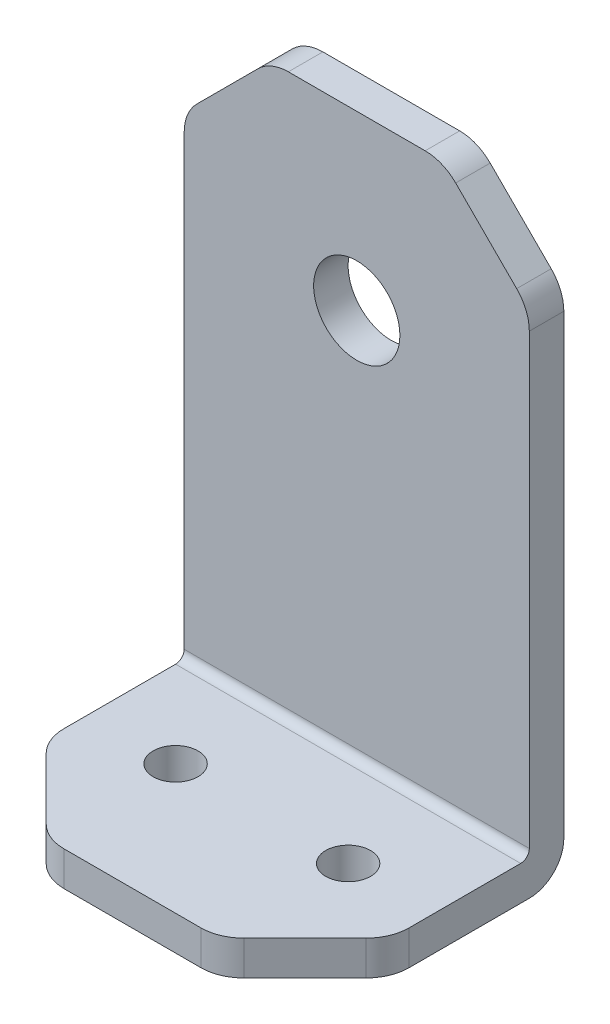
ISO-10303-21;
HEADER;
FILE_DESCRIPTION(('STEP AP214'),'2;1');
FILE_NAME('part.step','',(''),(''),'','','');
FILE_SCHEMA(('AUTOMOTIVE_DESIGN { 1 0 10303 214 1 1 1 1 }'));
ENDSEC;
DATA;
#1=APPLICATION_CONTEXT('core data for automotive mechanical design processes');
#2=APPLICATION_PROTOCOL_DEFINITION('international standard','automotive_design',2000,#1);
#3=PRODUCT_CONTEXT('',#1,'mechanical');
#4=PRODUCT('Part','Part','',(#3));
#5=PRODUCT_RELATED_PRODUCT_CATEGORY('part','',(#4));
#6=PRODUCT_DEFINITION_FORMATION('','',#4);
#7=PRODUCT_DEFINITION_CONTEXT('part definition',#1,'design');
#8=PRODUCT_DEFINITION('design','',#6,#7);
#9=PRODUCT_DEFINITION_SHAPE('','',#8);
#10=(LENGTH_UNIT() NAMED_UNIT(*) SI_UNIT(.MILLI.,.METRE.));
#11=(NAMED_UNIT(*) PLANE_ANGLE_UNIT() SI_UNIT($,.RADIAN.));
#12=(NAMED_UNIT(*) SI_UNIT($,.STERADIAN.) SOLID_ANGLE_UNIT());
#13=UNCERTAINTY_MEASURE_WITH_UNIT(LENGTH_MEASURE(1.E-05),#10,'distance_accuracy_value','');
#14=(GEOMETRIC_REPRESENTATION_CONTEXT(3) GLOBAL_UNCERTAINTY_ASSIGNED_CONTEXT((#13)) GLOBAL_UNIT_ASSIGNED_CONTEXT((#10,
#11,#12)) REPRESENTATION_CONTEXT('',''));
#15=CARTESIAN_POINT('',(0.,0.,0.));
#16=DIRECTION('',(0.,0.,1.));
#17=DIRECTION('',(1.,0.,0.));
#18=AXIS2_PLACEMENT_3D('',#15,#16,#17);
#19=CARTESIAN_POINT('',(0.,4.,0.));
#20=DIRECTION('',(0.,-1.,0.));
#21=DIRECTION('',(0.,0.,-1.));
#22=AXIS2_PLACEMENT_3D('',#19,#20,#21);
#23=PLANE('',#22);
#24=CARTESIAN_POINT('',(10.,4.,0.));
#25=DIRECTION('',(0.,1.,0.));
#26=DIRECTION('',(0.,0.,1.));
#27=AXIS2_PLACEMENT_3D('',#24,#25,#26);
#28=CIRCLE('',#27,2.6);
#29=CARTESIAN_POINT('',(10.,4.,2.6));
#30=VERTEX_POINT('',#29);
#31=EDGE_CURVE('E382',#30,#30,#28,.T.);
#32=ORIENTED_EDGE('',*,*,#31,.F.);
#33=EDGE_LOOP('',(#32));
#34=FACE_BOUND('',#33,.T.);
#35=CARTESIAN_POINT('',(-10.,4.,0.));
#36=DIRECTION('',(0.,1.,0.));
#37=DIRECTION('',(0.,0.,1.));
#38=AXIS2_PLACEMENT_3D('',#35,#36,#37);
#39=CIRCLE('',#38,2.6);
#40=CARTESIAN_POINT('',(-10.,4.,2.6));
#41=VERTEX_POINT('',#40);
#42=EDGE_CURVE('E376',#41,#41,#39,.T.);
#43=ORIENTED_EDGE('',*,*,#42,.F.);
#44=EDGE_LOOP('',(#43));
#45=FACE_BOUND('',#44,.T.);
#46=DIRECTION('',(0.,0.,-1.));
#47=VECTOR('',#46,1.);
#48=CARTESIAN_POINT('',(20.,4.,15.));
#49=LINE('',#48,#47);
#50=CARTESIAN_POINT('',(20.,4.,2.9289321881345));
#51=VERTEX_POINT('',#50);
#52=CARTESIAN_POINT('',(20.,4.,-10.));
#53=VERTEX_POINT('',#52);
#54=EDGE_CURVE('E322',#51,#53,#49,.T.);
#55=ORIENTED_EDGE('',*,*,#54,.T.);
#56=DIRECTION('',(1.,0.,0.));
#57=VECTOR('',#56,1.);
#58=CARTESIAN_POINT('',(-20.,4.,-10.));
#59=LINE('',#58,#57);
#60=CARTESIAN_POINT('',(-20.,4.,-10.));
#61=VERTEX_POINT('',#60);
#62=EDGE_CURVE('E52',#53,#61,#59,.F.);
#63=ORIENTED_EDGE('',*,*,#62,.T.);
#64=DIRECTION('',(0.,0.,1.));
#65=VECTOR('',#64,1.);
#66=CARTESIAN_POINT('',(-20.,4.,15.));
#67=LINE('',#66,#65);
#68=CARTESIAN_POINT('',(-20.,4.,2.92893218813448));
#69=VERTEX_POINT('',#68);
#70=EDGE_CURVE('E324',#61,#69,#67,.T.);
#71=ORIENTED_EDGE('',*,*,#70,.T.);
#72=CARTESIAN_POINT('',(-15.,4.,2.92893218813448));
#73=DIRECTION('',(0.,-1.,0.));
#74=DIRECTION('',(0.,0.,-1.));
#75=AXIS2_PLACEMENT_3D('',#72,#73,#74);
#76=CIRCLE('',#75,5.);
#77=CARTESIAN_POINT('',(-18.5355339059327,4.,6.46446609406721));
#78=VERTEX_POINT('',#77);
#79=EDGE_CURVE('E247',#69,#78,#76,.F.);
#80=ORIENTED_EDGE('',*,*,#79,.T.);
#81=DIRECTION('',(-0.707106781186547,0.,-0.707106781186548));
#82=VECTOR('',#81,1.);
#83=CARTESIAN_POINT('',(-9.99999999999999,4.,15.));
#84=LINE('',#83,#82);
#85=CARTESIAN_POINT('',(-11.4644660940673,4.,13.5355339059327));
#86=VERTEX_POINT('',#85);
#87=EDGE_CURVE('E226',#78,#86,#84,.F.);
#88=ORIENTED_EDGE('',*,*,#87,.T.);
#89=CARTESIAN_POINT('',(-7.92893218813451,4.,9.99999999999999));
#90=DIRECTION('',(0.,-1.,0.));
#91=DIRECTION('',(0.,0.,-1.));
#92=AXIS2_PLACEMENT_3D('',#89,#90,#91);
#93=CIRCLE('',#92,5.);
#94=CARTESIAN_POINT('',(-7.92893218813451,4.,15.));
#95=VERTEX_POINT('',#94);
#96=EDGE_CURVE('E249',#86,#95,#93,.F.);
#97=ORIENTED_EDGE('',*,*,#96,.T.);
#98=DIRECTION('',(1.,0.,0.));
#99=VECTOR('',#98,1.);
#100=CARTESIAN_POINT('',(-20.,4.,15.));
#101=LINE('',#100,#99);
#102=CARTESIAN_POINT('',(7.92893218813449,4.,15.));
#103=VERTEX_POINT('',#102);
#104=EDGE_CURVE('E185',#95,#103,#101,.T.);
#105=ORIENTED_EDGE('',*,*,#104,.T.);
#106=CARTESIAN_POINT('',(7.92893218813449,4.,9.99999999999999));
#107=DIRECTION('',(0.,-1.,0.));
#108=DIRECTION('',(0.,0.,-1.));
#109=AXIS2_PLACEMENT_3D('',#106,#107,#108);
#110=CIRCLE('',#109,5.);
#111=CARTESIAN_POINT('',(11.4644660940672,4.,13.5355339059327));
#112=VERTEX_POINT('',#111);
#113=EDGE_CURVE('E251',#103,#112,#110,.F.);
#114=ORIENTED_EDGE('',*,*,#113,.T.);
#115=DIRECTION('',(-0.707106781186548,0.,0.707106781186547));
#116=VECTOR('',#115,1.);
#117=CARTESIAN_POINT('',(20.,4.,4.99999999999998));
#118=LINE('',#117,#116);
#119=CARTESIAN_POINT('',(18.5355339059327,4.,6.46446609406724));
#120=VERTEX_POINT('',#119);
#121=EDGE_CURVE('E223',#112,#120,#118,.F.);
#122=ORIENTED_EDGE('',*,*,#121,.T.);
#123=CARTESIAN_POINT('',(15.,4.,2.9289321881345));
#124=DIRECTION('',(0.,-1.,0.));
#125=DIRECTION('',(0.,0.,-1.));
#126=AXIS2_PLACEMENT_3D('',#123,#124,#125);
#127=CIRCLE('',#126,5.);
#128=EDGE_CURVE('E253',#120,#51,#127,.F.);
#129=ORIENTED_EDGE('',*,*,#128,.T.);
#130=EDGE_LOOP('',(#55,#63,#71,#80,#88,#97,#105,#114,#122,#129));
#131=FACE_BOUND('',#130,.T.);
#132=ADVANCED_FACE('F37',(#34,#45,#131),#23,.F.);
#133=CARTESIAN_POINT('',(20.,4.,15.));
#134=DIRECTION('',(-1.,0.,0.));
#135=DIRECTION('',(0.,0.,1.));
#136=AXIS2_PLACEMENT_3D('',#133,#134,#135);
#137=PLANE('',#136);
#138=ORIENTED_EDGE('',*,*,#54,.F.);
#139=DIRECTION('',(0.,1.,0.));
#140=VECTOR('',#139,1.);
#141=CARTESIAN_POINT('',(20.,0.,2.9289321881345));
#142=LINE('',#141,#140);
#143=CARTESIAN_POINT('',(20.,0.,2.9289321881345));
#144=VERTEX_POINT('',#143);
#145=EDGE_CURVE('E232',#51,#144,#142,.F.);
#146=ORIENTED_EDGE('',*,*,#145,.T.);
#147=DIRECTION('',(0.,0.,-1.));
#148=VECTOR('',#147,1.);
#149=CARTESIAN_POINT('',(20.,0.,15.));
#150=LINE('',#149,#148);
#151=CARTESIAN_POINT('',(20.,0.,-11.));
#152=VERTEX_POINT('',#151);
#153=EDGE_CURVE('E315',#144,#152,#150,.T.);
#154=ORIENTED_EDGE('',*,*,#153,.T.);
#155=CARTESIAN_POINT('',(20.,4.,-11.));
#156=DIRECTION('',(-1.,0.,0.));
#157=DIRECTION('',(0.,0.,1.));
#158=AXIS2_PLACEMENT_3D('',#155,#156,#157);
#159=CIRCLE('',#158,4.);
#160=CARTESIAN_POINT('',(20.,4.,-15.));
#161=VERTEX_POINT('',#160);
#162=EDGE_CURVE('E204',#152,#161,#159,.F.);
#163=ORIENTED_EDGE('',*,*,#162,.T.);
#164=DIRECTION('',(0.,-1.,0.));
#165=VECTOR('',#164,1.);
#166=CARTESIAN_POINT('',(20.,4.,-15.));
#167=LINE('',#166,#165);
#168=CARTESIAN_POINT('',(20.,56.9289321881345,-15.));
#169=VERTEX_POINT('',#168);
#170=EDGE_CURVE('E184',#169,#161,#167,.T.);
#171=ORIENTED_EDGE('',*,*,#170,.F.);
#172=DIRECTION('',(0.,0.,1.));
#173=VECTOR('',#172,1.);
#174=CARTESIAN_POINT('',(20.,56.9289321881345,-11.));
#175=LINE('',#174,#173);
#176=CARTESIAN_POINT('',(20.,56.9289321881345,-11.));
#177=VERTEX_POINT('',#176);
#178=EDGE_CURVE('E229',#169,#177,#175,.T.);
#179=ORIENTED_EDGE('',*,*,#178,.T.);
#180=DIRECTION('',(0.,-1.,0.));
#181=VECTOR('',#180,1.);
#182=CARTESIAN_POINT('',(20.,69.,-11.));
#183=LINE('',#182,#181);
#184=CARTESIAN_POINT('',(20.,5.,-11.));
#185=VERTEX_POINT('',#184);
#186=EDGE_CURVE('E307',#177,#185,#183,.T.);
#187=ORIENTED_EDGE('',*,*,#186,.T.);
#188=CARTESIAN_POINT('',(20.,5.,-10.));
#189=DIRECTION('',(-1.,0.,0.));
#190=DIRECTION('',(0.,0.,1.));
#191=AXIS2_PLACEMENT_3D('',#188,#189,#190);
#192=CIRCLE('',#191,1.);
#193=EDGE_CURVE('E45',#185,#53,#192,.T.);
#194=ORIENTED_EDGE('',*,*,#193,.T.);
#195=EDGE_LOOP('',(#138,#146,#154,#163,#171,#179,#187,#194));
#196=FACE_BOUND('',#195,.T.);
#197=ADVANCED_FACE('F311',(#196),#137,.F.);
#198=CARTESIAN_POINT('',(-20.,4.,-15.));
#199=DIRECTION('',(0.,0.,1.));
#200=DIRECTION('',(1.,0.,0.));
#201=AXIS2_PLACEMENT_3D('',#198,#199,#200);
#202=PLANE('',#201);
#203=CARTESIAN_POINT('',(0.,49.,-15.));
#204=DIRECTION('',(0.,0.,1.));
#205=DIRECTION('',(1.,0.,0.));
#206=AXIS2_PLACEMENT_3D('',#203,#204,#205);
#207=CIRCLE('',#206,5.00000000000001);
#208=CARTESIAN_POINT('',(5.00000000000001,49.,-15.));
#209=VERTEX_POINT('',#208);
#210=EDGE_CURVE('E385',#209,#209,#207,.T.);
#211=ORIENTED_EDGE('',*,*,#210,.T.);
#212=EDGE_LOOP('',(#211));
#213=FACE_BOUND('',#212,.T.);
#214=DIRECTION('',(0.707106781186547,-0.707106781186548,0.));
#215=VECTOR('',#214,1.);
#216=CARTESIAN_POINT('',(9.99999999999998,69.,-15.));
#217=LINE('',#216,#215);
#218=CARTESIAN_POINT('',(11.4644660940672,67.5355339059327,-15.));
#219=VERTEX_POINT('',#218);
#220=CARTESIAN_POINT('',(18.5355339059327,60.4644660940672,-15.));
#221=VERTEX_POINT('',#220);
#222=EDGE_CURVE('E209',#219,#221,#217,.T.);
#223=ORIENTED_EDGE('',*,*,#222,.T.);
#224=CARTESIAN_POINT('',(15.,56.9289321881345,-15.));
#225=DIRECTION('',(0.,0.,1.));
#226=DIRECTION('',(1.,0.,0.));
#227=AXIS2_PLACEMENT_3D('',#224,#225,#226);
#228=CIRCLE('',#227,5.);
#229=EDGE_CURVE('E287',#221,#169,#228,.F.);
#230=ORIENTED_EDGE('',*,*,#229,.T.);
#231=ORIENTED_EDGE('',*,*,#170,.T.);
#232=DIRECTION('',(-1.,0.,0.));
#233=VECTOR('',#232,1.);
#234=CARTESIAN_POINT('',(-20.,4.,-15.));
#235=LINE('',#234,#233);
#236=CARTESIAN_POINT('',(-20.,4.,-15.));
#237=VERTEX_POINT('',#236);
#238=EDGE_CURVE('E192',#161,#237,#235,.T.);
#239=ORIENTED_EDGE('',*,*,#238,.T.);
#240=DIRECTION('',(0.,-1.,0.));
#241=VECTOR('',#240,1.);
#242=CARTESIAN_POINT('',(-20.,4.,-15.));
#243=LINE('',#242,#241);
#244=CARTESIAN_POINT('',(-20.,56.9289321881345,-15.));
#245=VERTEX_POINT('',#244);
#246=EDGE_CURVE('E173',#245,#237,#243,.T.);
#247=ORIENTED_EDGE('',*,*,#246,.F.);
#248=CARTESIAN_POINT('',(-15.,56.9289321881345,-15.));
#249=DIRECTION('',(0.,0.,1.));
#250=DIRECTION('',(1.,0.,0.));
#251=AXIS2_PLACEMENT_3D('',#248,#249,#250);
#252=CIRCLE('',#251,5.);
#253=CARTESIAN_POINT('',(-18.5355339059328,60.4644660940672,-15.));
#254=VERTEX_POINT('',#253);
#255=EDGE_CURVE('E281',#245,#254,#252,.F.);
#256=ORIENTED_EDGE('',*,*,#255,.T.);
#257=DIRECTION('',(0.707106781186547,0.707106781186548,0.));
#258=VECTOR('',#257,1.);
#259=CARTESIAN_POINT('',(-9.99999999999999,69.,-15.));
#260=LINE('',#259,#258);
#261=CARTESIAN_POINT('',(-11.4644660940673,67.5355339059327,-15.));
#262=VERTEX_POINT('',#261);
#263=EDGE_CURVE('E206',#254,#262,#260,.T.);
#264=ORIENTED_EDGE('',*,*,#263,.T.);
#265=CARTESIAN_POINT('',(-7.92893218813451,64.,-15.));
#266=DIRECTION('',(0.,0.,1.));
#267=DIRECTION('',(1.,0.,0.));
#268=AXIS2_PLACEMENT_3D('',#265,#266,#267);
#269=CIRCLE('',#268,5.);
#270=CARTESIAN_POINT('',(-7.92893218813451,69.,-15.));
#271=VERTEX_POINT('',#270);
#272=EDGE_CURVE('E283',#262,#271,#269,.F.);
#273=ORIENTED_EDGE('',*,*,#272,.T.);
#274=DIRECTION('',(-1.,0.,0.));
#275=VECTOR('',#274,1.);
#276=CARTESIAN_POINT('',(-20.,69.,-15.));
#277=LINE('',#276,#275);
#278=CARTESIAN_POINT('',(7.9289321881345,69.,-15.));
#279=VERTEX_POINT('',#278);
#280=EDGE_CURVE('E313',#279,#271,#277,.T.);
#281=ORIENTED_EDGE('',*,*,#280,.F.);
#282=CARTESIAN_POINT('',(7.9289321881345,64.,-15.));
#283=DIRECTION('',(0.,0.,1.));
#284=DIRECTION('',(1.,0.,0.));
#285=AXIS2_PLACEMENT_3D('',#282,#283,#284);
#286=CIRCLE('',#285,5.);
#287=EDGE_CURVE('E285',#279,#219,#286,.F.);
#288=ORIENTED_EDGE('',*,*,#287,.T.);
#289=EDGE_LOOP('',(#223,#230,#231,#239,#247,#256,#264,#273,#281,#288));
#290=FACE_BOUND('',#289,.T.);
#291=ADVANCED_FACE('F197',(#213,#290),#202,.F.);
#292=CARTESIAN_POINT('',(-20.,4.,15.));
#293=DIRECTION('',(1.,0.,0.));
#294=DIRECTION('',(0.,0.,-1.));
#295=AXIS2_PLACEMENT_3D('',#292,#293,#294);
#296=PLANE('',#295);
#297=DIRECTION('',(0.,0.,1.));
#298=VECTOR('',#297,1.);
#299=CARTESIAN_POINT('',(-20.,0.,15.));
#300=LINE('',#299,#298);
#301=CARTESIAN_POINT('',(-20.,0.,-11.));
#302=VERTEX_POINT('',#301);
#303=CARTESIAN_POINT('',(-20.,0.,2.92893218813448));
#304=VERTEX_POINT('',#303);
#305=EDGE_CURVE('E330',#302,#304,#300,.T.);
#306=ORIENTED_EDGE('',*,*,#305,.T.);
#307=DIRECTION('',(0.,-1.,0.));
#308=VECTOR('',#307,1.);
#309=CARTESIAN_POINT('',(-20.,4.,2.92893218813448));
#310=LINE('',#309,#308);
#311=EDGE_CURVE('E266',#304,#69,#310,.F.);
#312=ORIENTED_EDGE('',*,*,#311,.T.);
#313=ORIENTED_EDGE('',*,*,#70,.F.);
#314=CARTESIAN_POINT('',(-20.,5.,-10.));
#315=DIRECTION('',(1.,0.,0.));
#316=DIRECTION('',(0.,0.,-1.));
#317=AXIS2_PLACEMENT_3D('',#314,#315,#316);
#318=CIRCLE('',#317,1.);
#319=CARTESIAN_POINT('',(-20.,5.,-11.));
#320=VERTEX_POINT('',#319);
#321=EDGE_CURVE('E11',#61,#320,#318,.T.);
#322=ORIENTED_EDGE('',*,*,#321,.T.);
#323=DIRECTION('',(0.,-1.,0.));
#324=VECTOR('',#323,1.);
#325=CARTESIAN_POINT('',(-20.,69.,-11.));
#326=LINE('',#325,#324);
#327=CARTESIAN_POINT('',(-20.,56.9289321881345,-11.));
#328=VERTEX_POINT('',#327);
#329=EDGE_CURVE('E308',#328,#320,#326,.T.);
#330=ORIENTED_EDGE('',*,*,#329,.F.);
#331=DIRECTION('',(0.,0.,-1.));
#332=VECTOR('',#331,1.);
#333=CARTESIAN_POINT('',(-20.,56.9289321881345,-15.));
#334=LINE('',#333,#332);
#335=EDGE_CURVE('E181',#328,#245,#334,.T.);
#336=ORIENTED_EDGE('',*,*,#335,.T.);
#337=ORIENTED_EDGE('',*,*,#246,.T.);
#338=CARTESIAN_POINT('',(-20.,4.,-11.));
#339=DIRECTION('',(1.,0.,0.));
#340=DIRECTION('',(0.,0.,-1.));
#341=AXIS2_PLACEMENT_3D('',#338,#339,#340);
#342=CIRCLE('',#341,4.);
#343=EDGE_CURVE('E177',#237,#302,#342,.F.);
#344=ORIENTED_EDGE('',*,*,#343,.T.);
#345=EDGE_LOOP('',(#306,#312,#313,#322,#330,#336,#337,#344));
#346=FACE_BOUND('',#345,.T.);
#347=ADVANCED_FACE('F176',(#346),#296,.F.);
#348=CARTESIAN_POINT('',(-20.,4.,15.));
#349=DIRECTION('',(0.,0.,-1.));
#350=DIRECTION('',(-1.,0.,0.));
#351=AXIS2_PLACEMENT_3D('',#348,#349,#350);
#352=PLANE('',#351);
#353=DIRECTION('',(1.,0.,0.));
#354=VECTOR('',#353,1.);
#355=CARTESIAN_POINT('',(-20.,0.,15.));
#356=LINE('',#355,#354);
#357=CARTESIAN_POINT('',(-7.92893218813451,0.,15.));
#358=VERTEX_POINT('',#357);
#359=CARTESIAN_POINT('',(7.92893218813449,0.,15.));
#360=VERTEX_POINT('',#359);
#361=EDGE_CURVE('E325',#358,#360,#356,.T.);
#362=ORIENTED_EDGE('',*,*,#361,.T.);
#363=DIRECTION('',(0.,-1.,0.));
#364=VECTOR('',#363,1.);
#365=CARTESIAN_POINT('',(7.92893218813449,4.,15.));
#366=LINE('',#365,#364);
#367=EDGE_CURVE('E258',#360,#103,#366,.F.);
#368=ORIENTED_EDGE('',*,*,#367,.T.);
#369=ORIENTED_EDGE('',*,*,#104,.F.);
#370=DIRECTION('',(0.,1.,0.));
#371=VECTOR('',#370,1.);
#372=CARTESIAN_POINT('',(-7.92893218813451,0.,15.));
#373=LINE('',#372,#371);
#374=EDGE_CURVE('E255',#95,#358,#373,.F.);
#375=ORIENTED_EDGE('',*,*,#374,.T.);
#376=EDGE_LOOP('',(#362,#368,#369,#375));
#377=FACE_BOUND('',#376,.T.);
#378=ADVANCED_FACE('F336',(#377),#352,.F.);
#379=CARTESIAN_POINT('',(0.,0.,0.));
#380=DIRECTION('',(0.,-1.,0.));
#381=DIRECTION('',(0.,0.,-1.));
#382=AXIS2_PLACEMENT_3D('',#379,#380,#381);
#383=PLANE('',#382);
#384=CARTESIAN_POINT('',(10.,0.,0.));
#385=DIRECTION('',(0.,1.,0.));
#386=DIRECTION('',(0.,0.,1.));
#387=AXIS2_PLACEMENT_3D('',#384,#385,#386);
#388=CIRCLE('',#387,2.6);
#389=CARTESIAN_POINT('',(10.,0.,2.6));
#390=VERTEX_POINT('',#389);
#391=EDGE_CURVE('E380',#390,#390,#388,.T.);
#392=ORIENTED_EDGE('',*,*,#391,.T.);
#393=EDGE_LOOP('',(#392));
#394=FACE_BOUND('',#393,.T.);
#395=CARTESIAN_POINT('',(-10.,0.,0.));
#396=DIRECTION('',(0.,1.,0.));
#397=DIRECTION('',(0.,0.,1.));
#398=AXIS2_PLACEMENT_3D('',#395,#396,#397);
#399=CIRCLE('',#398,2.6);
#400=CARTESIAN_POINT('',(-10.,0.,2.6));
#401=VERTEX_POINT('',#400);
#402=EDGE_CURVE('E374',#401,#401,#399,.T.);
#403=ORIENTED_EDGE('',*,*,#402,.T.);
#404=EDGE_LOOP('',(#403));
#405=FACE_BOUND('',#404,.T.);
#406=ORIENTED_EDGE('',*,*,#153,.F.);
#407=CARTESIAN_POINT('',(15.,0.,2.9289321881345));
#408=DIRECTION('',(0.,-1.,0.));
#409=DIRECTION('',(0.,0.,-1.));
#410=AXIS2_PLACEMENT_3D('',#407,#408,#409);
#411=CIRCLE('',#410,5.);
#412=CARTESIAN_POINT('',(18.5355339059327,0.,6.46446609406724));
#413=VERTEX_POINT('',#412);
#414=EDGE_CURVE('E241',#144,#413,#411,.T.);
#415=ORIENTED_EDGE('',*,*,#414,.T.);
#416=DIRECTION('',(0.707106781186548,0.,-0.707106781186547));
#417=VECTOR('',#416,1.);
#418=CARTESIAN_POINT('',(12.5,0.,12.5));
#419=LINE('',#418,#417);
#420=CARTESIAN_POINT('',(11.4644660940672,0.,13.5355339059327));
#421=VERTEX_POINT('',#420);
#422=EDGE_CURVE('E217',#413,#421,#419,.F.);
#423=ORIENTED_EDGE('',*,*,#422,.T.);
#424=CARTESIAN_POINT('',(7.92893218813449,0.,9.99999999999999));
#425=DIRECTION('',(0.,-1.,0.));
#426=DIRECTION('',(0.,0.,-1.));
#427=AXIS2_PLACEMENT_3D('',#424,#425,#426);
#428=CIRCLE('',#427,5.);
#429=EDGE_CURVE('E239',#421,#360,#428,.T.);
#430=ORIENTED_EDGE('',*,*,#429,.T.);
#431=ORIENTED_EDGE('',*,*,#361,.F.);
#432=CARTESIAN_POINT('',(-7.92893218813451,0.,9.99999999999999));
#433=DIRECTION('',(0.,-1.,0.));
#434=DIRECTION('',(0.,0.,-1.));
#435=AXIS2_PLACEMENT_3D('',#432,#433,#434);
#436=CIRCLE('',#435,5.);
#437=CARTESIAN_POINT('',(-11.4644660940673,0.,13.5355339059327));
#438=VERTEX_POINT('',#437);
#439=EDGE_CURVE('E237',#358,#438,#436,.T.);
#440=ORIENTED_EDGE('',*,*,#439,.T.);
#441=DIRECTION('',(0.707106781186547,0.,0.707106781186548));
#442=VECTOR('',#441,1.);
#443=CARTESIAN_POINT('',(-12.5,0.,12.5));
#444=LINE('',#443,#442);
#445=CARTESIAN_POINT('',(-18.5355339059327,0.,6.46446609406722));
#446=VERTEX_POINT('',#445);
#447=EDGE_CURVE('E220',#438,#446,#444,.F.);
#448=ORIENTED_EDGE('',*,*,#447,.T.);
#449=CARTESIAN_POINT('',(-15.,0.,2.92893218813448));
#450=DIRECTION('',(0.,-1.,0.));
#451=DIRECTION('',(0.,0.,-1.));
#452=AXIS2_PLACEMENT_3D('',#449,#450,#451);
#453=CIRCLE('',#452,5.);
#454=EDGE_CURVE('E235',#446,#304,#453,.T.);
#455=ORIENTED_EDGE('',*,*,#454,.T.);
#456=ORIENTED_EDGE('',*,*,#305,.F.);
#457=DIRECTION('',(-1.,0.,0.));
#458=VECTOR('',#457,1.);
#459=CARTESIAN_POINT('',(20.,0.,-11.));
#460=LINE('',#459,#458);
#461=EDGE_CURVE('E194',#302,#152,#460,.F.);
#462=ORIENTED_EDGE('',*,*,#461,.T.);
#463=EDGE_LOOP('',(#406,#415,#423,#430,#431,#440,#448,#455,#456,#462));
#464=FACE_BOUND('',#463,.T.);
#465=ADVANCED_FACE('F354',(#394,#405,#464),#383,.T.);
#466=CARTESIAN_POINT('',(-20.,69.,-11.));
#467=DIRECTION('',(0.,0.,-1.));
#468=DIRECTION('',(-1.,0.,0.));
#469=AXIS2_PLACEMENT_3D('',#466,#467,#468);
#470=PLANE('',#469);
#471=CARTESIAN_POINT('',(0.,49.,-11.));
#472=DIRECTION('',(0.,0.,1.));
#473=DIRECTION('',(1.,0.,0.));
#474=AXIS2_PLACEMENT_3D('',#471,#472,#473);
#475=CIRCLE('',#474,5.00000000000001);
#476=CARTESIAN_POINT('',(5.00000000000001,49.,-11.));
#477=VERTEX_POINT('',#476);
#478=EDGE_CURVE('E388',#477,#477,#475,.T.);
#479=ORIENTED_EDGE('',*,*,#478,.F.);
#480=EDGE_LOOP('',(#479));
#481=FACE_BOUND('',#480,.T.);
#482=ORIENTED_EDGE('',*,*,#329,.T.);
#483=DIRECTION('',(1.,0.,0.));
#484=VECTOR('',#483,1.);
#485=CARTESIAN_POINT('',(20.,5.,-11.));
#486=LINE('',#485,#484);
#487=EDGE_CURVE('E299',#320,#185,#486,.T.);
#488=ORIENTED_EDGE('',*,*,#487,.T.);
#489=ORIENTED_EDGE('',*,*,#186,.F.);
#490=CARTESIAN_POINT('',(15.,56.9289321881345,-11.));
#491=DIRECTION('',(0.,0.,-1.));
#492=DIRECTION('',(-1.,0.,0.));
#493=AXIS2_PLACEMENT_3D('',#490,#491,#492);
#494=CIRCLE('',#493,5.);
#495=CARTESIAN_POINT('',(18.5355339059327,60.4644660940672,-11.));
#496=VERTEX_POINT('',#495);
#497=EDGE_CURVE('E275',#177,#496,#494,.F.);
#498=ORIENTED_EDGE('',*,*,#497,.T.);
#499=DIRECTION('',(-0.707106781186547,0.707106781186548,0.));
#500=VECTOR('',#499,1.);
#501=CARTESIAN_POINT('',(9.99999999999998,69.,-11.));
#502=LINE('',#501,#500);
#503=CARTESIAN_POINT('',(11.4644660940672,67.5355339059327,-11.));
#504=VERTEX_POINT('',#503);
#505=EDGE_CURVE('E214',#496,#504,#502,.T.);
#506=ORIENTED_EDGE('',*,*,#505,.T.);
#507=CARTESIAN_POINT('',(7.9289321881345,64.,-11.));
#508=DIRECTION('',(0.,0.,-1.));
#509=DIRECTION('',(-1.,0.,0.));
#510=AXIS2_PLACEMENT_3D('',#507,#508,#509);
#511=CIRCLE('',#510,5.);
#512=CARTESIAN_POINT('',(7.9289321881345,69.,-11.));
#513=VERTEX_POINT('',#512);
#514=EDGE_CURVE('E273',#504,#513,#511,.F.);
#515=ORIENTED_EDGE('',*,*,#514,.T.);
#516=DIRECTION('',(1.,0.,0.));
#517=VECTOR('',#516,1.);
#518=CARTESIAN_POINT('',(-20.,69.,-11.));
#519=LINE('',#518,#517);
#520=CARTESIAN_POINT('',(-7.92893218813451,69.,-11.));
#521=VERTEX_POINT('',#520);
#522=EDGE_CURVE('E318',#521,#513,#519,.T.);
#523=ORIENTED_EDGE('',*,*,#522,.F.);
#524=CARTESIAN_POINT('',(-7.92893218813451,64.,-11.));
#525=DIRECTION('',(0.,0.,-1.));
#526=DIRECTION('',(-1.,0.,0.));
#527=AXIS2_PLACEMENT_3D('',#524,#525,#526);
#528=CIRCLE('',#527,5.);
#529=CARTESIAN_POINT('',(-11.4644660940673,67.5355339059327,-11.));
#530=VERTEX_POINT('',#529);
#531=EDGE_CURVE('E271',#521,#530,#528,.F.);
#532=ORIENTED_EDGE('',*,*,#531,.T.);
#533=DIRECTION('',(-0.707106781186547,-0.707106781186548,0.));
#534=VECTOR('',#533,1.);
#535=CARTESIAN_POINT('',(-9.99999999999999,69.,-11.));
#536=LINE('',#535,#534);
#537=CARTESIAN_POINT('',(-18.5355339059328,60.4644660940672,-11.));
#538=VERTEX_POINT('',#537);
#539=EDGE_CURVE('E211',#530,#538,#536,.T.);
#540=ORIENTED_EDGE('',*,*,#539,.T.);
#541=CARTESIAN_POINT('',(-15.,56.9289321881345,-11.));
#542=DIRECTION('',(0.,0.,-1.));
#543=DIRECTION('',(-1.,0.,0.));
#544=AXIS2_PLACEMENT_3D('',#541,#542,#543);
#545=CIRCLE('',#544,5.);
#546=EDGE_CURVE('E269',#538,#328,#545,.F.);
#547=ORIENTED_EDGE('',*,*,#546,.T.);
#548=EDGE_LOOP('',(#482,#488,#489,#498,#506,#515,#523,#532,#540,#547));
#549=FACE_BOUND('',#548,.T.);
#550=ADVANCED_FACE('F306',(#481,#549),#470,.F.);
#551=CARTESIAN_POINT('',(0.,69.,0.));
#552=DIRECTION('',(0.,1.,0.));
#553=DIRECTION('',(0.,0.,1.));
#554=AXIS2_PLACEMENT_3D('',#551,#552,#553);
#555=PLANE('',#554);
#556=ORIENTED_EDGE('',*,*,#522,.T.);
#557=DIRECTION('',(0.,0.,-1.));
#558=VECTOR('',#557,1.);
#559=CARTESIAN_POINT('',(7.9289321881345,69.,0.));
#560=LINE('',#559,#558);
#561=EDGE_CURVE('E292',#513,#279,#560,.T.);
#562=ORIENTED_EDGE('',*,*,#561,.T.);
#563=ORIENTED_EDGE('',*,*,#280,.T.);
#564=DIRECTION('',(0.,0.,1.));
#565=VECTOR('',#564,1.);
#566=CARTESIAN_POINT('',(-7.92893218813451,69.,0.));
#567=LINE('',#566,#565);
#568=EDGE_CURVE('E289',#271,#521,#567,.T.);
#569=ORIENTED_EDGE('',*,*,#568,.T.);
#570=EDGE_LOOP('',(#556,#562,#563,#569));
#571=FACE_BOUND('',#570,.T.);
#572=ADVANCED_FACE('F371',(#571),#555,.T.);
#573=CARTESIAN_POINT('',(-20.,4.,-11.));
#574=DIRECTION('',(1.,0.,0.));
#575=DIRECTION('',(0.,0.,-1.));
#576=AXIS2_PLACEMENT_3D('',#573,#574,#575);
#577=CYLINDRICAL_SURFACE('',#576,4.);
#578=ORIENTED_EDGE('',*,*,#162,.F.);
#579=ORIENTED_EDGE('',*,*,#461,.F.);
#580=ORIENTED_EDGE('',*,*,#343,.F.);
#581=ORIENTED_EDGE('',*,*,#238,.F.);
#582=EDGE_LOOP('',(#578,#579,#580,#581));
#583=FACE_BOUND('',#582,.T.);
#584=ADVANCED_FACE('F191',(#583),#577,.T.);
#585=CARTESIAN_POINT('',(-10.,0.,0.));
#586=DIRECTION('',(0.,1.,0.));
#587=DIRECTION('',(0.,0.,1.));
#588=AXIS2_PLACEMENT_3D('',#585,#586,#587);
#589=CYLINDRICAL_SURFACE('',#588,2.6);
#590=ORIENTED_EDGE('',*,*,#402,.F.);
#591=EDGE_LOOP('',(#590));
#592=FACE_BOUND('',#591,.T.);
#593=ORIENTED_EDGE('',*,*,#42,.T.);
#594=EDGE_LOOP('',(#593));
#595=FACE_BOUND('',#594,.T.);
#596=ADVANCED_FACE('F429',(#592,#595),#589,.F.);
#597=CARTESIAN_POINT('',(10.,0.,0.));
#598=DIRECTION('',(0.,1.,0.));
#599=DIRECTION('',(0.,0.,1.));
#600=AXIS2_PLACEMENT_3D('',#597,#598,#599);
#601=CYLINDRICAL_SURFACE('',#600,2.6);
#602=ORIENTED_EDGE('',*,*,#391,.F.);
#603=EDGE_LOOP('',(#602));
#604=FACE_BOUND('',#603,.T.);
#605=ORIENTED_EDGE('',*,*,#31,.T.);
#606=EDGE_LOOP('',(#605));
#607=FACE_BOUND('',#606,.T.);
#608=ADVANCED_FACE('F398',(#604,#607),#601,.F.);
#609=CARTESIAN_POINT('',(0.,49.,-15.));
#610=DIRECTION('',(0.,0.,1.));
#611=DIRECTION('',(1.,0.,0.));
#612=AXIS2_PLACEMENT_3D('',#609,#610,#611);
#613=CYLINDRICAL_SURFACE('',#612,5.00000000000001);
#614=ORIENTED_EDGE('',*,*,#210,.F.);
#615=EDGE_LOOP('',(#614));
#616=FACE_BOUND('',#615,.T.);
#617=ORIENTED_EDGE('',*,*,#478,.T.);
#618=EDGE_LOOP('',(#617));
#619=FACE_BOUND('',#618,.T.);
#620=ADVANCED_FACE('F395',(#616,#619),#613,.F.);
#621=CARTESIAN_POINT('',(9.99999999999998,69.,0.));
#622=DIRECTION('',(0.707106781186548,0.707106781186547,0.));
#623=DIRECTION('',(0.,0.,1.));
#624=AXIS2_PLACEMENT_3D('',#621,#622,#623);
#625=PLANE('',#624);
#626=ORIENTED_EDGE('',*,*,#505,.F.);
#627=DIRECTION('',(0.,0.,1.));
#628=VECTOR('',#627,1.);
#629=CARTESIAN_POINT('',(18.5355339059327,60.4644660940672,-15.));
#630=LINE('',#629,#628);
#631=EDGE_CURVE('E279',#496,#221,#630,.F.);
#632=ORIENTED_EDGE('',*,*,#631,.T.);
#633=ORIENTED_EDGE('',*,*,#222,.F.);
#634=DIRECTION('',(0.,0.,-1.));
#635=VECTOR('',#634,1.);
#636=CARTESIAN_POINT('',(11.4644660940672,67.5355339059327,0.));
#637=LINE('',#636,#635);
#638=EDGE_CURVE('E277',#219,#504,#637,.F.);
#639=ORIENTED_EDGE('',*,*,#638,.T.);
#640=EDGE_LOOP('',(#626,#632,#633,#639));
#641=FACE_BOUND('',#640,.T.);
#642=ADVANCED_FACE('F362',(#641),#625,.T.);
#643=CARTESIAN_POINT('',(-9.99999999999999,69.,0.));
#644=DIRECTION('',(-0.707106781186548,0.707106781186547,0.));
#645=DIRECTION('',(0.,0.,-1.));
#646=AXIS2_PLACEMENT_3D('',#643,#644,#645);
#647=PLANE('',#646);
#648=ORIENTED_EDGE('',*,*,#539,.F.);
#649=DIRECTION('',(0.,0.,1.));
#650=VECTOR('',#649,1.);
#651=CARTESIAN_POINT('',(-11.4644660940673,67.5355339059327,0.));
#652=LINE('',#651,#650);
#653=EDGE_CURVE('E297',#530,#262,#652,.F.);
#654=ORIENTED_EDGE('',*,*,#653,.T.);
#655=ORIENTED_EDGE('',*,*,#263,.F.);
#656=DIRECTION('',(0.,0.,-1.));
#657=VECTOR('',#656,1.);
#658=CARTESIAN_POINT('',(-18.5355339059328,60.4644660940672,-11.));
#659=LINE('',#658,#657);
#660=EDGE_CURVE('E295',#254,#538,#659,.F.);
#661=ORIENTED_EDGE('',*,*,#660,.T.);
#662=EDGE_LOOP('',(#648,#654,#655,#661));
#663=FACE_BOUND('',#662,.T.);
#664=ADVANCED_FACE('F436',(#663),#647,.T.);
#665=CARTESIAN_POINT('',(-9.99999999999999,4.,15.));
#666=DIRECTION('',(0.707106781186548,0.,-0.707106781186547));
#667=DIRECTION('',(0.,-1.,0.));
#668=AXIS2_PLACEMENT_3D('',#665,#666,#667);
#669=PLANE('',#668);
#670=ORIENTED_EDGE('',*,*,#447,.F.);
#671=DIRECTION('',(0.,-1.,0.));
#672=VECTOR('',#671,1.);
#673=CARTESIAN_POINT('',(-11.4644660940673,4.,13.5355339059327));
#674=LINE('',#673,#672);
#675=EDGE_CURVE('E263',#438,#86,#674,.F.);
#676=ORIENTED_EDGE('',*,*,#675,.T.);
#677=ORIENTED_EDGE('',*,*,#87,.F.);
#678=DIRECTION('',(0.,1.,0.));
#679=VECTOR('',#678,1.);
#680=CARTESIAN_POINT('',(-18.5355339059327,0.,6.46446609406722));
#681=LINE('',#680,#679);
#682=EDGE_CURVE('E261',#78,#446,#681,.F.);
#683=ORIENTED_EDGE('',*,*,#682,.T.);
#684=EDGE_LOOP('',(#670,#676,#677,#683));
#685=FACE_BOUND('',#684,.T.);
#686=ADVANCED_FACE('F442',(#685),#669,.F.);
#687=CARTESIAN_POINT('',(20.,4.,4.99999999999998));
#688=DIRECTION('',(-0.707106781186547,0.,-0.707106781186548));
#689=DIRECTION('',(0.,-1.,0.));
#690=AXIS2_PLACEMENT_3D('',#687,#688,#689);
#691=PLANE('',#690);
#692=ORIENTED_EDGE('',*,*,#422,.F.);
#693=DIRECTION('',(0.,-1.,0.));
#694=VECTOR('',#693,1.);
#695=CARTESIAN_POINT('',(18.5355339059327,4.,6.46446609406724));
#696=LINE('',#695,#694);
#697=EDGE_CURVE('E245',#413,#120,#696,.F.);
#698=ORIENTED_EDGE('',*,*,#697,.T.);
#699=ORIENTED_EDGE('',*,*,#121,.F.);
#700=DIRECTION('',(0.,1.,0.));
#701=VECTOR('',#700,1.);
#702=CARTESIAN_POINT('',(11.4644660940672,0.,13.5355339059327));
#703=LINE('',#702,#701);
#704=EDGE_CURVE('E243',#112,#421,#703,.F.);
#705=ORIENTED_EDGE('',*,*,#704,.T.);
#706=EDGE_LOOP('',(#692,#698,#699,#705));
#707=FACE_BOUND('',#706,.T.);
#708=ADVANCED_FACE('F348',(#707),#691,.F.);
#709=CARTESIAN_POINT('',(15.,4.,2.9289321881345));
#710=DIRECTION('',(0.,-1.,0.));
#711=DIRECTION('',(0.,0.,-1.));
#712=AXIS2_PLACEMENT_3D('',#709,#710,#711);
#713=CYLINDRICAL_SURFACE('',#712,5.);
#714=ORIENTED_EDGE('',*,*,#128,.F.);
#715=ORIENTED_EDGE('',*,*,#697,.F.);
#716=ORIENTED_EDGE('',*,*,#414,.F.);
#717=ORIENTED_EDGE('',*,*,#145,.F.);
#718=EDGE_LOOP('',(#714,#715,#716,#717));
#719=FACE_BOUND('',#718,.T.);
#720=ADVANCED_FACE('F351',(#719),#713,.T.);
#721=CARTESIAN_POINT('',(7.92893218813449,4.,9.99999999999999));
#722=DIRECTION('',(0.,1.,0.));
#723=DIRECTION('',(0.,0.,1.));
#724=AXIS2_PLACEMENT_3D('',#721,#722,#723);
#725=CYLINDRICAL_SURFACE('',#724,5.);
#726=ORIENTED_EDGE('',*,*,#429,.F.);
#727=ORIENTED_EDGE('',*,*,#704,.F.);
#728=ORIENTED_EDGE('',*,*,#113,.F.);
#729=ORIENTED_EDGE('',*,*,#367,.F.);
#730=EDGE_LOOP('',(#726,#727,#728,#729));
#731=FACE_BOUND('',#730,.T.);
#732=ADVANCED_FACE('F342',(#731),#725,.T.);
#733=CARTESIAN_POINT('',(-7.92893218813451,4.,9.99999999999999));
#734=DIRECTION('',(0.,-1.,0.));
#735=DIRECTION('',(0.,0.,-1.));
#736=AXIS2_PLACEMENT_3D('',#733,#734,#735);
#737=CYLINDRICAL_SURFACE('',#736,5.);
#738=ORIENTED_EDGE('',*,*,#96,.F.);
#739=ORIENTED_EDGE('',*,*,#675,.F.);
#740=ORIENTED_EDGE('',*,*,#439,.F.);
#741=ORIENTED_EDGE('',*,*,#374,.F.);
#742=EDGE_LOOP('',(#738,#739,#740,#741));
#743=FACE_BOUND('',#742,.T.);
#744=ADVANCED_FACE('F458',(#743),#737,.T.);
#745=CARTESIAN_POINT('',(-15.,4.,2.92893218813448));
#746=DIRECTION('',(0.,1.,0.));
#747=DIRECTION('',(0.,0.,1.));
#748=AXIS2_PLACEMENT_3D('',#745,#746,#747);
#749=CYLINDRICAL_SURFACE('',#748,5.);
#750=ORIENTED_EDGE('',*,*,#454,.F.);
#751=ORIENTED_EDGE('',*,*,#682,.F.);
#752=ORIENTED_EDGE('',*,*,#79,.F.);
#753=ORIENTED_EDGE('',*,*,#311,.F.);
#754=EDGE_LOOP('',(#750,#751,#752,#753));
#755=FACE_BOUND('',#754,.T.);
#756=ADVANCED_FACE('F461',(#755),#749,.T.);
#757=CARTESIAN_POINT('',(15.,56.9289321881345,15.));
#758=DIRECTION('',(0.,0.,-1.));
#759=DIRECTION('',(-1.,0.,0.));
#760=AXIS2_PLACEMENT_3D('',#757,#758,#759);
#761=CYLINDRICAL_SURFACE('',#760,5.);
#762=ORIENTED_EDGE('',*,*,#229,.F.);
#763=ORIENTED_EDGE('',*,*,#631,.F.);
#764=ORIENTED_EDGE('',*,*,#497,.F.);
#765=ORIENTED_EDGE('',*,*,#178,.F.);
#766=EDGE_LOOP('',(#762,#763,#764,#765));
#767=FACE_BOUND('',#766,.T.);
#768=ADVANCED_FACE('F357',(#767),#761,.T.);
#769=CARTESIAN_POINT('',(7.9289321881345,64.,0.));
#770=DIRECTION('',(0.,0.,-1.));
#771=DIRECTION('',(-1.,0.,0.));
#772=AXIS2_PLACEMENT_3D('',#769,#770,#771);
#773=CYLINDRICAL_SURFACE('',#772,5.);
#774=ORIENTED_EDGE('',*,*,#514,.F.);
#775=ORIENTED_EDGE('',*,*,#638,.F.);
#776=ORIENTED_EDGE('',*,*,#287,.F.);
#777=ORIENTED_EDGE('',*,*,#561,.F.);
#778=EDGE_LOOP('',(#774,#775,#776,#777));
#779=FACE_BOUND('',#778,.T.);
#780=ADVANCED_FACE('F366',(#779),#773,.T.);
#781=CARTESIAN_POINT('',(-7.92893218813451,64.,0.));
#782=DIRECTION('',(0.,0.,1.));
#783=DIRECTION('',(1.,0.,0.));
#784=AXIS2_PLACEMENT_3D('',#781,#782,#783);
#785=CYLINDRICAL_SURFACE('',#784,5.);
#786=ORIENTED_EDGE('',*,*,#272,.F.);
#787=ORIENTED_EDGE('',*,*,#653,.F.);
#788=ORIENTED_EDGE('',*,*,#531,.F.);
#789=ORIENTED_EDGE('',*,*,#568,.F.);
#790=EDGE_LOOP('',(#786,#787,#788,#789));
#791=FACE_BOUND('',#790,.T.);
#792=ADVANCED_FACE('F470',(#791),#785,.T.);
#793=CARTESIAN_POINT('',(-15.,56.9289321881345,15.));
#794=DIRECTION('',(0.,0.,1.));
#795=DIRECTION('',(1.,0.,0.));
#796=AXIS2_PLACEMENT_3D('',#793,#794,#795);
#797=CYLINDRICAL_SURFACE('',#796,5.);
#798=ORIENTED_EDGE('',*,*,#546,.F.);
#799=ORIENTED_EDGE('',*,*,#660,.F.);
#800=ORIENTED_EDGE('',*,*,#255,.F.);
#801=ORIENTED_EDGE('',*,*,#335,.F.);
#802=EDGE_LOOP('',(#798,#799,#800,#801));
#803=FACE_BOUND('',#802,.T.);
#804=ADVANCED_FACE('F472',(#803),#797,.T.);
#805=CARTESIAN_POINT('',(-20.,5.,-10.));
#806=DIRECTION('',(-1.,0.,0.));
#807=DIRECTION('',(0.,0.,1.));
#808=AXIS2_PLACEMENT_3D('',#805,#806,#807);
#809=CYLINDRICAL_SURFACE('',#808,1.);
#810=ORIENTED_EDGE('',*,*,#321,.F.);
#811=ORIENTED_EDGE('',*,*,#62,.F.);
#812=ORIENTED_EDGE('',*,*,#193,.F.);
#813=ORIENTED_EDGE('',*,*,#487,.F.);
#814=EDGE_LOOP('',(#810,#811,#812,#813));
#815=FACE_BOUND('',#814,.T.);
#816=ADVANCED_FACE('F39',(#815),#809,.F.);
#817=CLOSED_SHELL('',(#132,#197,#291,#347,#378,#465,#550,#572,#584,#596,#608,#620,#642,#664,
#686,#708,#720,#732,#744,#756,#768,#780,#792,#804,#816));
#818=MANIFOLD_SOLID_BREP('B2',#817);
#819=ADVANCED_BREP_SHAPE_REPRESENTATION('',(#18,#818),#14);
#820=SHAPE_DEFINITION_REPRESENTATION(#9,#819);
ENDSEC;
END-ISO-10303-21;
